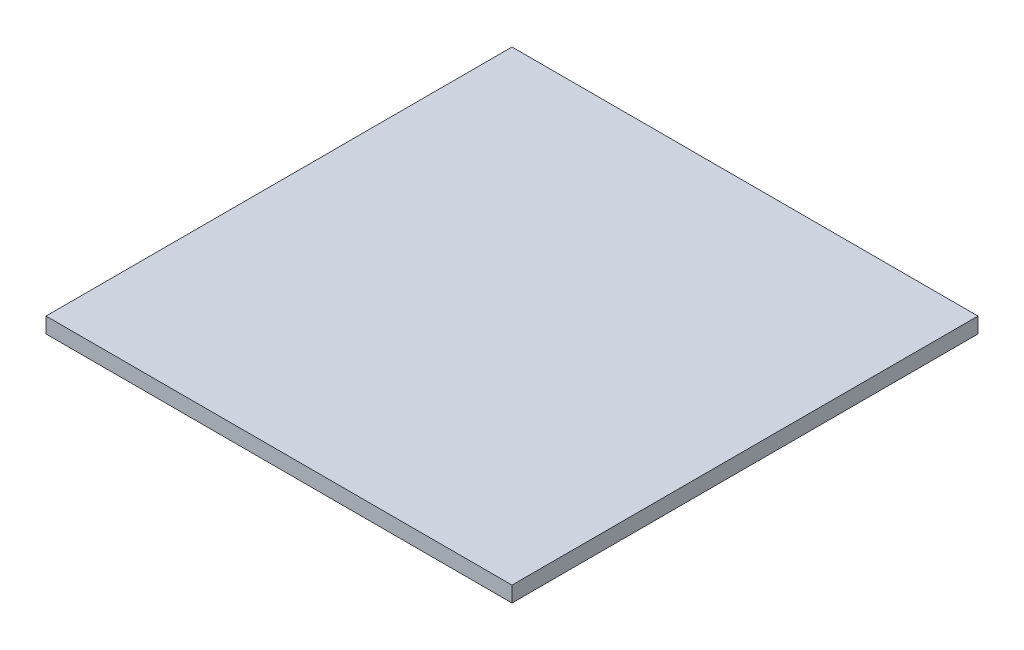
ISO-10303-21;
HEADER;
FILE_DESCRIPTION(('STEP AP214'),'2;1');
FILE_NAME('part.step','',(''),(''),'','','');
FILE_SCHEMA(('AUTOMOTIVE_DESIGN { 1 0 10303 214 1 1 1 1 }'));
ENDSEC;
DATA;
#1=APPLICATION_CONTEXT('core data for automotive mechanical design processes');
#2=APPLICATION_PROTOCOL_DEFINITION('international standard','automotive_design',2000,#1);
#3=PRODUCT_CONTEXT('',#1,'mechanical');
#4=PRODUCT('Part','Part','',(#3));
#5=PRODUCT_RELATED_PRODUCT_CATEGORY('part','',(#4));
#6=PRODUCT_DEFINITION_FORMATION('','',#4);
#7=PRODUCT_DEFINITION_CONTEXT('part definition',#1,'design');
#8=PRODUCT_DEFINITION('design','',#6,#7);
#9=PRODUCT_DEFINITION_SHAPE('','',#8);
#10=(LENGTH_UNIT() NAMED_UNIT(*) SI_UNIT(.MILLI.,.METRE.));
#11=(NAMED_UNIT(*) PLANE_ANGLE_UNIT() SI_UNIT($,.RADIAN.));
#12=(NAMED_UNIT(*) SI_UNIT($,.STERADIAN.) SOLID_ANGLE_UNIT());
#13=UNCERTAINTY_MEASURE_WITH_UNIT(LENGTH_MEASURE(1.E-05),#10,'distance_accuracy_value','');
#14=(GEOMETRIC_REPRESENTATION_CONTEXT(3) GLOBAL_UNCERTAINTY_ASSIGNED_CONTEXT((#13)) GLOBAL_UNIT_ASSIGNED_CONTEXT((#10,
#11,#12)) REPRESENTATION_CONTEXT('',''));
#15=CARTESIAN_POINT('',(0.,0.,0.));
#16=DIRECTION('',(0.,0.,1.));
#17=DIRECTION('',(1.,0.,0.));
#18=AXIS2_PLACEMENT_3D('',#15,#16,#17);
#19=CARTESIAN_POINT('',(-28276.4415316072,1000.,-1169.11764705882));
#20=DIRECTION('',(1.,0.,0.));
#21=DIRECTION('',(0.,0.,-1.));
#22=AXIS2_PLACEMENT_3D('',#19,#20,#21);
#23=PLANE('',#22);
#24=DIRECTION('',(0.,0.,1.));
#25=VECTOR('',#24,1.);
#26=CARTESIAN_POINT('',(-28276.4415316072,0.,-1169.11764705882));
#27=LINE('',#26,#25);
#28=CARTESIAN_POINT('',(-28276.4415316072,0.,-1169.11764705882));
#29=VERTEX_POINT('',#28);
#30=CARTESIAN_POINT('',(-28276.4415316071,0.,28830.8823529412));
#31=VERTEX_POINT('',#30);
#32=EDGE_CURVE('E102',#29,#31,#27,.T.);
#33=ORIENTED_EDGE('',*,*,#32,.T.);
#34=DIRECTION('',(0.,-1.,0.));
#35=VECTOR('',#34,1.);
#36=CARTESIAN_POINT('',(-28276.4415316071,1000.,28830.8823529412));
#37=LINE('',#36,#35);
#38=CARTESIAN_POINT('',(-28276.4415316071,1000.,28830.8823529412));
#39=VERTEX_POINT('',#38);
#40=EDGE_CURVE('E11',#39,#31,#37,.T.);
#41=ORIENTED_EDGE('',*,*,#40,.F.);
#42=DIRECTION('',(0.,0.,1.));
#43=VECTOR('',#42,1.);
#44=CARTESIAN_POINT('',(-28276.4415316072,1000.,-1169.11764705882));
#45=LINE('',#44,#43);
#46=CARTESIAN_POINT('',(-28276.4415316072,1000.,-1169.11764705882));
#47=VERTEX_POINT('',#46);
#48=EDGE_CURVE('E90',#47,#39,#45,.T.);
#49=ORIENTED_EDGE('',*,*,#48,.F.);
#50=DIRECTION('',(0.,-1.,0.));
#51=VECTOR('',#50,1.);
#52=CARTESIAN_POINT('',(-28276.4415316072,1000.,-1169.11764705882));
#53=LINE('',#52,#51);
#54=EDGE_CURVE('E98',#47,#29,#53,.T.);
#55=ORIENTED_EDGE('',*,*,#54,.T.);
#56=EDGE_LOOP('',(#33,#41,#49,#55));
#57=FACE_BOUND('',#56,.T.);
#58=ADVANCED_FACE('F39',(#57),#23,.F.);
#59=CARTESIAN_POINT('',(-28276.4415316071,1000.,28830.8823529412));
#60=DIRECTION('',(0.,0.,-1.));
#61=DIRECTION('',(-1.,0.,0.));
#62=AXIS2_PLACEMENT_3D('',#59,#60,#61);
#63=PLANE('',#62);
#64=DIRECTION('',(1.,0.,0.));
#65=VECTOR('',#64,1.);
#66=CARTESIAN_POINT('',(-28276.4415316071,0.,28830.8823529412));
#67=LINE('',#66,#65);
#68=CARTESIAN_POINT('',(1723.55846839285,0.,28830.8823529412));
#69=VERTEX_POINT('',#68);
#70=EDGE_CURVE('E94',#31,#69,#67,.T.);
#71=ORIENTED_EDGE('',*,*,#70,.T.);
#72=DIRECTION('',(0.,-1.,0.));
#73=VECTOR('',#72,1.);
#74=CARTESIAN_POINT('',(1723.55846839285,1000.,28830.8823529412));
#75=LINE('',#74,#73);
#76=CARTESIAN_POINT('',(1723.55846839285,1000.,28830.8823529412));
#77=VERTEX_POINT('',#76);
#78=EDGE_CURVE('E47',#77,#69,#75,.T.);
#79=ORIENTED_EDGE('',*,*,#78,.F.);
#80=DIRECTION('',(1.,0.,0.));
#81=VECTOR('',#80,1.);
#82=CARTESIAN_POINT('',(-28276.4415316071,1000.,28830.8823529412));
#83=LINE('',#82,#81);
#84=EDGE_CURVE('E85',#39,#77,#83,.T.);
#85=ORIENTED_EDGE('',*,*,#84,.F.);
#86=ORIENTED_EDGE('',*,*,#40,.T.);
#87=EDGE_LOOP('',(#71,#79,#85,#86));
#88=FACE_BOUND('',#87,.T.);
#89=ADVANCED_FACE('F93',(#88),#63,.F.);
#90=CARTESIAN_POINT('',(1723.55846839285,1000.,-1169.11764705882));
#91=DIRECTION('',(-1.,0.,0.));
#92=DIRECTION('',(0.,0.,1.));
#93=AXIS2_PLACEMENT_3D('',#90,#91,#92);
#94=PLANE('',#93);
#95=DIRECTION('',(0.,0.,-1.));
#96=VECTOR('',#95,1.);
#97=CARTESIAN_POINT('',(1723.55846839285,0.,-1169.11764705882));
#98=LINE('',#97,#96);
#99=CARTESIAN_POINT('',(1723.55846839285,0.,-1169.11764705882));
#100=VERTEX_POINT('',#99);
#101=EDGE_CURVE('E72',#69,#100,#98,.T.);
#102=ORIENTED_EDGE('',*,*,#101,.T.);
#103=DIRECTION('',(0.,-1.,0.));
#104=VECTOR('',#103,1.);
#105=CARTESIAN_POINT('',(1723.55846839285,1000.,-1169.11764705882));
#106=LINE('',#105,#104);
#107=CARTESIAN_POINT('',(1723.55846839285,1000.,-1169.11764705882));
#108=VERTEX_POINT('',#107);
#109=EDGE_CURVE('E95',#108,#100,#106,.T.);
#110=ORIENTED_EDGE('',*,*,#109,.F.);
#111=DIRECTION('',(0.,0.,-1.));
#112=VECTOR('',#111,1.);
#113=CARTESIAN_POINT('',(1723.55846839285,1000.,-1169.11764705882));
#114=LINE('',#113,#112);
#115=EDGE_CURVE('E88',#77,#108,#114,.T.);
#116=ORIENTED_EDGE('',*,*,#115,.F.);
#117=ORIENTED_EDGE('',*,*,#78,.T.);
#118=EDGE_LOOP('',(#102,#110,#116,#117));
#119=FACE_BOUND('',#118,.T.);
#120=ADVANCED_FACE('F96',(#119),#94,.F.);
#121=CARTESIAN_POINT('',(-28276.4415316072,1000.,-1169.11764705882));
#122=DIRECTION('',(0.,0.,1.));
#123=DIRECTION('',(1.,0.,0.));
#124=AXIS2_PLACEMENT_3D('',#121,#122,#123);
#125=PLANE('',#124);
#126=DIRECTION('',(-1.,0.,0.));
#127=VECTOR('',#126,1.);
#128=CARTESIAN_POINT('',(-28276.4415316072,0.,-1169.11764705882));
#129=LINE('',#128,#127);
#130=EDGE_CURVE('E78',#100,#29,#129,.T.);
#131=ORIENTED_EDGE('',*,*,#130,.T.);
#132=ORIENTED_EDGE('',*,*,#54,.F.);
#133=DIRECTION('',(-1.,0.,0.));
#134=VECTOR('',#133,1.);
#135=CARTESIAN_POINT('',(-28276.4415316072,1000.,-1169.11764705882));
#136=LINE('',#135,#134);
#137=EDGE_CURVE('E55',#108,#47,#136,.T.);
#138=ORIENTED_EDGE('',*,*,#137,.F.);
#139=ORIENTED_EDGE('',*,*,#109,.T.);
#140=EDGE_LOOP('',(#131,#132,#138,#139));
#141=FACE_BOUND('',#140,.T.);
#142=ADVANCED_FACE('F109',(#141),#125,.F.);
#143=CARTESIAN_POINT('',(0.,1000.,0.));
#144=DIRECTION('',(0.,1.,0.));
#145=DIRECTION('',(0.,0.,1.));
#146=AXIS2_PLACEMENT_3D('',#143,#144,#145);
#147=PLANE('',#146);
#148=ORIENTED_EDGE('',*,*,#48,.T.);
#149=ORIENTED_EDGE('',*,*,#84,.T.);
#150=ORIENTED_EDGE('',*,*,#115,.T.);
#151=ORIENTED_EDGE('',*,*,#137,.T.);
#152=EDGE_LOOP('',(#148,#149,#150,#151));
#153=FACE_BOUND('',#152,.T.);
#154=ADVANCED_FACE('F86',(#153),#147,.T.);
#155=CARTESIAN_POINT('',(0.,0.,0.));
#156=DIRECTION('',(0.,1.,0.));
#157=DIRECTION('',(0.,0.,1.));
#158=AXIS2_PLACEMENT_3D('',#155,#156,#157);
#159=PLANE('',#158);
#160=ORIENTED_EDGE('',*,*,#32,.F.);
#161=ORIENTED_EDGE('',*,*,#130,.F.);
#162=ORIENTED_EDGE('',*,*,#101,.F.);
#163=ORIENTED_EDGE('',*,*,#70,.F.);
#164=EDGE_LOOP('',(#160,#161,#162,#163));
#165=FACE_BOUND('',#164,.T.);
#166=ADVANCED_FACE('F112',(#165),#159,.F.);
#167=CLOSED_SHELL('',(#58,#89,#120,#142,#154,#166));
#168=MANIFOLD_SOLID_BREP('B2',#167);
#169=ADVANCED_BREP_SHAPE_REPRESENTATION('',(#18,#168),#14);
#170=SHAPE_DEFINITION_REPRESENTATION(#9,#169);
ENDSEC;
END-ISO-10303-21;
